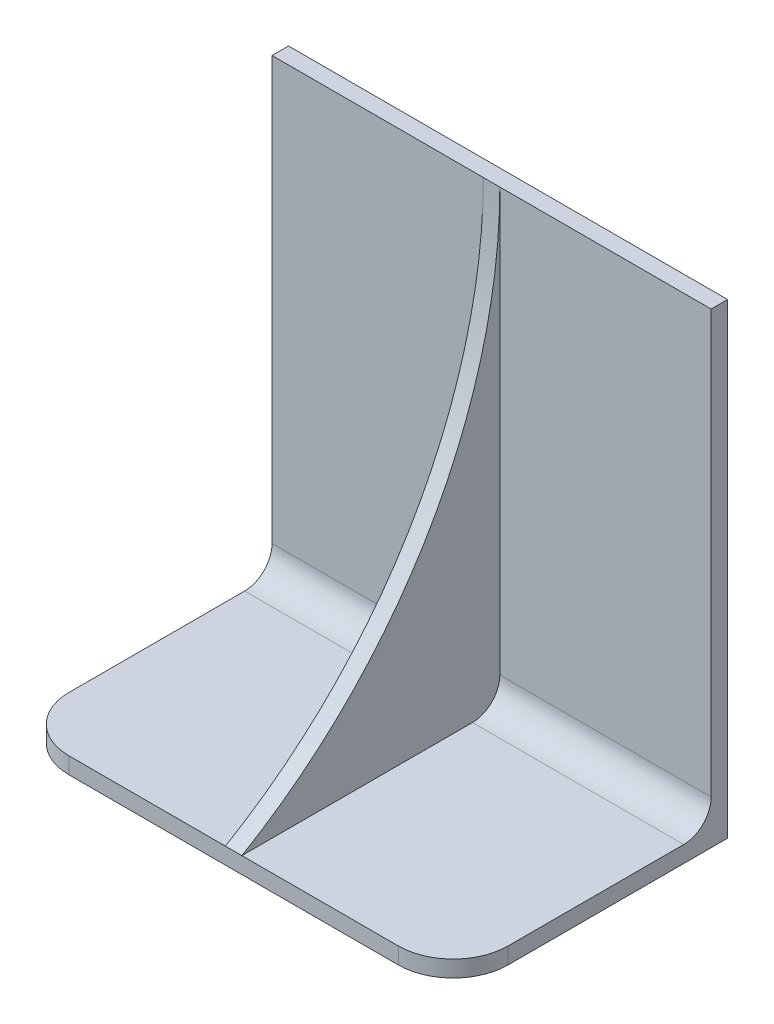
ISO-10303-21;
HEADER;
FILE_DESCRIPTION(('STEP AP214'),'2;1');
FILE_NAME('part.step','',(''),(''),'','','');
FILE_SCHEMA(('AUTOMOTIVE_DESIGN { 1 0 10303 214 1 1 1 1 }'));
ENDSEC;
DATA;
#1=APPLICATION_CONTEXT('core data for automotive mechanical design processes');
#2=APPLICATION_PROTOCOL_DEFINITION('international standard','automotive_design',2000,#1);
#3=PRODUCT_CONTEXT('',#1,'mechanical');
#4=PRODUCT('Part','Part','',(#3));
#5=PRODUCT_RELATED_PRODUCT_CATEGORY('part','',(#4));
#6=PRODUCT_DEFINITION_FORMATION('','',#4);
#7=PRODUCT_DEFINITION_CONTEXT('part definition',#1,'design');
#8=PRODUCT_DEFINITION('design','',#6,#7);
#9=PRODUCT_DEFINITION_SHAPE('','',#8);
#10=(LENGTH_UNIT() NAMED_UNIT(*) SI_UNIT(.MILLI.,.METRE.));
#11=(NAMED_UNIT(*) PLANE_ANGLE_UNIT() SI_UNIT($,.RADIAN.));
#12=(NAMED_UNIT(*) SI_UNIT($,.STERADIAN.) SOLID_ANGLE_UNIT());
#13=UNCERTAINTY_MEASURE_WITH_UNIT(LENGTH_MEASURE(1.E-05),#10,'distance_accuracy_value','');
#14=(GEOMETRIC_REPRESENTATION_CONTEXT(3) GLOBAL_UNCERTAINTY_ASSIGNED_CONTEXT((#13)) GLOBAL_UNIT_ASSIGNED_CONTEXT((#10,
#11,#12)) REPRESENTATION_CONTEXT('',''));
#15=CARTESIAN_POINT('',(0.,0.,0.));
#16=DIRECTION('',(0.,0.,1.));
#17=DIRECTION('',(1.,0.,0.));
#18=AXIS2_PLACEMENT_3D('',#15,#16,#17);
#19=CARTESIAN_POINT('',(0.,3.,0.));
#20=DIRECTION('',(0.,-1.,0.));
#21=DIRECTION('',(0.,0.,-1.));
#22=AXIS2_PLACEMENT_3D('',#19,#20,#21);
#23=PLANE('',#22);
#24=DIRECTION('',(0.,0.,-1.));
#25=VECTOR('',#24,1.);
#26=CARTESIAN_POINT('',(40.,3.,25.));
#27=LINE('',#26,#25);
#28=CARTESIAN_POINT('',(40.,3.,15.));
#29=VERTEX_POINT('',#28);
#30=CARTESIAN_POINT('',(40.,3.,-17.));
#31=VERTEX_POINT('',#30);
#32=EDGE_CURVE('E188',#29,#31,#27,.T.);
#33=ORIENTED_EDGE('',*,*,#32,.T.);
#34=DIRECTION('',(1.,0.,0.));
#35=VECTOR('',#34,1.);
#36=CARTESIAN_POINT('',(1.5,3.,-17.));
#37=LINE('',#36,#35);
#38=CARTESIAN_POINT('',(1.5,3.,-17.));
#39=VERTEX_POINT('',#38);
#40=EDGE_CURVE('E174',#31,#39,#37,.F.);
#41=ORIENTED_EDGE('',*,*,#40,.T.);
#42=DIRECTION('',(0.,0.,-1.));
#43=VECTOR('',#42,1.);
#44=CARTESIAN_POINT('',(1.5,3.,25.));
#45=LINE('',#44,#43);
#46=CARTESIAN_POINT('',(1.5,3.,25.));
#47=VERTEX_POINT('',#46);
#48=EDGE_CURVE('E145',#47,#39,#45,.T.);
#49=ORIENTED_EDGE('',*,*,#48,.F.);
#50=DIRECTION('',(1.,0.,0.));
#51=VECTOR('',#50,1.);
#52=CARTESIAN_POINT('',(-40.,3.,25.));
#53=LINE('',#52,#51);
#54=CARTESIAN_POINT('',(30.,3.,25.));
#55=VERTEX_POINT('',#54);
#56=EDGE_CURVE('E171',#47,#55,#53,.T.);
#57=ORIENTED_EDGE('',*,*,#56,.T.);
#58=CARTESIAN_POINT('',(30.,3.,15.));
#59=DIRECTION('',(0.,-1.,0.));
#60=DIRECTION('',(0.,0.,-1.));
#61=AXIS2_PLACEMENT_3D('',#58,#59,#60);
#62=CIRCLE('',#61,10.);
#63=EDGE_CURVE('E236',#55,#29,#62,.F.);
#64=ORIENTED_EDGE('',*,*,#63,.T.);
#65=EDGE_LOOP('',(#33,#41,#49,#57,#64));
#66=FACE_BOUND('',#65,.T.);
#67=ADVANCED_FACE('F45',(#66),#23,.F.);
#68=CARTESIAN_POINT('',(-40.,85.,-22.));
#69=DIRECTION('',(0.,0.,-1.));
#70=DIRECTION('',(-1.,0.,0.));
#71=AXIS2_PLACEMENT_3D('',#68,#69,#70);
#72=PLANE('',#71);
#73=DIRECTION('',(0.,1.,0.));
#74=VECTOR('',#73,1.);
#75=CARTESIAN_POINT('',(1.5,85.,-22.));
#76=LINE('',#75,#74);
#77=CARTESIAN_POINT('',(1.5,7.99999999999999,-22.));
#78=VERTEX_POINT('',#77);
#79=CARTESIAN_POINT('',(1.5,85.,-22.));
#80=VERTEX_POINT('',#79);
#81=EDGE_CURVE('E148',#78,#80,#76,.T.);
#82=ORIENTED_EDGE('',*,*,#81,.F.);
#83=DIRECTION('',(1.,0.,0.));
#84=VECTOR('',#83,1.);
#85=CARTESIAN_POINT('',(40.,7.99999999999999,-22.));
#86=LINE('',#85,#84);
#87=CARTESIAN_POINT('',(40.,7.99999999999999,-22.));
#88=VERTEX_POINT('',#87);
#89=EDGE_CURVE('E239',#78,#88,#86,.T.);
#90=ORIENTED_EDGE('',*,*,#89,.T.);
#91=DIRECTION('',(0.,-1.,0.));
#92=VECTOR('',#91,1.);
#93=CARTESIAN_POINT('',(40.,85.,-22.));
#94=LINE('',#93,#92);
#95=CARTESIAN_POINT('',(40.,85.,-22.));
#96=VERTEX_POINT('',#95);
#97=EDGE_CURVE('E263',#96,#88,#94,.T.);
#98=ORIENTED_EDGE('',*,*,#97,.F.);
#99=DIRECTION('',(1.,0.,0.));
#100=VECTOR('',#99,1.);
#101=CARTESIAN_POINT('',(-40.,85.,-22.));
#102=LINE('',#101,#100);
#103=EDGE_CURVE('E270',#80,#96,#102,.T.);
#104=ORIENTED_EDGE('',*,*,#103,.F.);
#105=EDGE_LOOP('',(#82,#90,#98,#104));
#106=FACE_BOUND('',#105,.T.);
#107=ADVANCED_FACE('F269',(#106),#72,.F.);
#108=DIRECTION('',(0.,0.,-1.));
#109=VECTOR('',#108,1.);
#110=CARTESIAN_POINT('',(-1.5,3.,25.));
#111=LINE('',#110,#109);
#112=CARTESIAN_POINT('',(-1.5,3.,25.));
#113=VERTEX_POINT('',#112);
#114=CARTESIAN_POINT('',(-1.5,3.,-17.));
#115=VERTEX_POINT('',#114);
#116=EDGE_CURVE('E279',#113,#115,#111,.T.);
#117=ORIENTED_EDGE('',*,*,#116,.T.);
#118=DIRECTION('',(1.,0.,0.));
#119=VECTOR('',#118,1.);
#120=CARTESIAN_POINT('',(-40.,3.,-17.));
#121=LINE('',#120,#119);
#122=CARTESIAN_POINT('',(-40.,3.,-17.));
#123=VERTEX_POINT('',#122);
#124=EDGE_CURVE('E61',#115,#123,#121,.F.);
#125=ORIENTED_EDGE('',*,*,#124,.T.);
#126=DIRECTION('',(0.,0.,1.));
#127=VECTOR('',#126,1.);
#128=CARTESIAN_POINT('',(-40.,3.,25.));
#129=LINE('',#128,#127);
#130=CARTESIAN_POINT('',(-40.,3.,15.));
#131=VERTEX_POINT('',#130);
#132=EDGE_CURVE('E183',#123,#131,#129,.T.);
#133=ORIENTED_EDGE('',*,*,#132,.T.);
#134=CARTESIAN_POINT('',(-30.,3.,15.));
#135=DIRECTION('',(0.,-1.,0.));
#136=DIRECTION('',(0.,0.,-1.));
#137=AXIS2_PLACEMENT_3D('',#134,#135,#136);
#138=CIRCLE('',#137,10.);
#139=CARTESIAN_POINT('',(-30.,3.,25.));
#140=VERTEX_POINT('',#139);
#141=EDGE_CURVE('E229',#131,#140,#138,.F.);
#142=ORIENTED_EDGE('',*,*,#141,.T.);
#143=EDGE_CURVE('E182',#140,#113,#53,.T.);
#144=ORIENTED_EDGE('',*,*,#143,.T.);
#145=EDGE_LOOP('',(#117,#125,#133,#142,#144));
#146=FACE_BOUND('',#145,.T.);
#147=ADVANCED_FACE('F314',(#146),#23,.F.);
#148=CARTESIAN_POINT('',(40.,3.,25.));
#149=DIRECTION('',(-1.,0.,0.));
#150=DIRECTION('',(0.,0.,1.));
#151=AXIS2_PLACEMENT_3D('',#148,#149,#150);
#152=PLANE('',#151);
#153=ORIENTED_EDGE('',*,*,#32,.F.);
#154=DIRECTION('',(0.,-1.,0.));
#155=VECTOR('',#154,1.);
#156=CARTESIAN_POINT('',(40.,3.,15.));
#157=LINE('',#156,#155);
#158=CARTESIAN_POINT('',(40.,0.,15.));
#159=VERTEX_POINT('',#158);
#160=EDGE_CURVE('E232',#29,#159,#157,.T.);
#161=ORIENTED_EDGE('',*,*,#160,.T.);
#162=DIRECTION('',(0.,0.,-1.));
#163=VECTOR('',#162,1.);
#164=CARTESIAN_POINT('',(40.,0.,25.));
#165=LINE('',#164,#163);
#166=CARTESIAN_POINT('',(40.,0.,-25.));
#167=VERTEX_POINT('',#166);
#168=EDGE_CURVE('E192',#159,#167,#165,.T.);
#169=ORIENTED_EDGE('',*,*,#168,.T.);
#170=DIRECTION('',(0.,-1.,0.));
#171=VECTOR('',#170,1.);
#172=CARTESIAN_POINT('',(40.,3.,-25.));
#173=LINE('',#172,#171);
#174=CARTESIAN_POINT('',(40.,85.,-25.));
#175=VERTEX_POINT('',#174);
#176=EDGE_CURVE('E209',#175,#167,#173,.T.);
#177=ORIENTED_EDGE('',*,*,#176,.F.);
#178=DIRECTION('',(0.,0.,-1.));
#179=VECTOR('',#178,1.);
#180=CARTESIAN_POINT('',(40.,85.,-25.));
#181=LINE('',#180,#179);
#182=EDGE_CURVE('E291',#96,#175,#181,.T.);
#183=ORIENTED_EDGE('',*,*,#182,.F.);
#184=ORIENTED_EDGE('',*,*,#97,.T.);
#185=CARTESIAN_POINT('',(40.,7.99999999999999,-17.));
#186=DIRECTION('',(-1.,0.,0.));
#187=DIRECTION('',(0.,0.,1.));
#188=AXIS2_PLACEMENT_3D('',#185,#186,#187);
#189=CIRCLE('',#188,5.);
#190=EDGE_CURVE('E54',#88,#31,#189,.T.);
#191=ORIENTED_EDGE('',*,*,#190,.T.);
#192=EDGE_LOOP('',(#153,#161,#169,#177,#183,#184,#191));
#193=FACE_BOUND('',#192,.T.);
#194=ADVANCED_FACE('F259',(#193),#152,.F.);
#195=CARTESIAN_POINT('',(-40.,3.,-25.));
#196=DIRECTION('',(0.,0.,1.));
#197=DIRECTION('',(1.,0.,0.));
#198=AXIS2_PLACEMENT_3D('',#195,#196,#197);
#199=PLANE('',#198);
#200=DIRECTION('',(-1.,0.,0.));
#201=VECTOR('',#200,1.);
#202=CARTESIAN_POINT('',(-40.,0.,-25.));
#203=LINE('',#202,#201);
#204=CARTESIAN_POINT('',(-40.,0.,-25.));
#205=VERTEX_POINT('',#204);
#206=EDGE_CURVE('E195',#167,#205,#203,.T.);
#207=ORIENTED_EDGE('',*,*,#206,.T.);
#208=DIRECTION('',(0.,-1.,0.));
#209=VECTOR('',#208,1.);
#210=CARTESIAN_POINT('',(-40.,3.,-25.));
#211=LINE('',#210,#209);
#212=CARTESIAN_POINT('',(-40.,85.,-25.));
#213=VERTEX_POINT('',#212);
#214=EDGE_CURVE('E187',#213,#205,#211,.T.);
#215=ORIENTED_EDGE('',*,*,#214,.F.);
#216=DIRECTION('',(-1.,0.,0.));
#217=VECTOR('',#216,1.);
#218=CARTESIAN_POINT('',(-40.,85.,-25.));
#219=LINE('',#218,#217);
#220=EDGE_CURVE('E295',#175,#213,#219,.T.);
#221=ORIENTED_EDGE('',*,*,#220,.F.);
#222=ORIENTED_EDGE('',*,*,#176,.T.);
#223=EDGE_LOOP('',(#207,#215,#221,#222));
#224=FACE_BOUND('',#223,.T.);
#225=ADVANCED_FACE('F325',(#224),#199,.F.);
#226=CARTESIAN_POINT('',(-40.,3.,25.));
#227=DIRECTION('',(1.,0.,0.));
#228=DIRECTION('',(0.,0.,-1.));
#229=AXIS2_PLACEMENT_3D('',#226,#227,#228);
#230=PLANE('',#229);
#231=DIRECTION('',(0.,0.,1.));
#232=VECTOR('',#231,1.);
#233=CARTESIAN_POINT('',(-40.,0.,25.));
#234=LINE('',#233,#232);
#235=CARTESIAN_POINT('',(-40.,0.,15.));
#236=VERTEX_POINT('',#235);
#237=EDGE_CURVE('E199',#205,#236,#234,.T.);
#238=ORIENTED_EDGE('',*,*,#237,.T.);
#239=DIRECTION('',(0.,-1.,0.));
#240=VECTOR('',#239,1.);
#241=CARTESIAN_POINT('',(-40.,3.,15.));
#242=LINE('',#241,#240);
#243=EDGE_CURVE('E225',#236,#131,#242,.F.);
#244=ORIENTED_EDGE('',*,*,#243,.T.);
#245=ORIENTED_EDGE('',*,*,#132,.F.);
#246=CARTESIAN_POINT('',(-40.,7.99999999999999,-17.));
#247=DIRECTION('',(1.,0.,0.));
#248=DIRECTION('',(0.,0.,-1.));
#249=AXIS2_PLACEMENT_3D('',#246,#247,#248);
#250=CIRCLE('',#249,5.);
#251=CARTESIAN_POINT('',(-40.,7.99999999999999,-22.));
#252=VERTEX_POINT('',#251);
#253=EDGE_CURVE('E11',#123,#252,#250,.T.);
#254=ORIENTED_EDGE('',*,*,#253,.T.);
#255=DIRECTION('',(0.,-1.,0.));
#256=VECTOR('',#255,1.);
#257=CARTESIAN_POINT('',(-40.,85.,-22.));
#258=LINE('',#257,#256);
#259=CARTESIAN_POINT('',(-40.,85.,-22.));
#260=VERTEX_POINT('',#259);
#261=EDGE_CURVE('E196',#260,#252,#258,.T.);
#262=ORIENTED_EDGE('',*,*,#261,.F.);
#263=DIRECTION('',(0.,0.,1.));
#264=VECTOR('',#263,1.);
#265=CARTESIAN_POINT('',(-40.,85.,-25.));
#266=LINE('',#265,#264);
#267=EDGE_CURVE('E165',#213,#260,#266,.T.);
#268=ORIENTED_EDGE('',*,*,#267,.F.);
#269=ORIENTED_EDGE('',*,*,#214,.T.);
#270=EDGE_LOOP('',(#238,#244,#245,#254,#262,#268,#269));
#271=FACE_BOUND('',#270,.T.);
#272=ADVANCED_FACE('F311',(#271),#230,.F.);
#273=CARTESIAN_POINT('',(-40.,3.,25.));
#274=DIRECTION('',(0.,0.,-1.));
#275=DIRECTION('',(-1.,0.,0.));
#276=AXIS2_PLACEMENT_3D('',#273,#274,#275);
#277=PLANE('',#276);
#278=ORIENTED_EDGE('',*,*,#143,.F.);
#279=DIRECTION('',(0.,-1.,0.));
#280=VECTOR('',#279,1.);
#281=CARTESIAN_POINT('',(-30.,3.,25.));
#282=LINE('',#281,#280);
#283=CARTESIAN_POINT('',(-30.,0.,25.));
#284=VERTEX_POINT('',#283);
#285=EDGE_CURVE('E215',#140,#284,#282,.T.);
#286=ORIENTED_EDGE('',*,*,#285,.T.);
#287=DIRECTION('',(1.,0.,0.));
#288=VECTOR('',#287,1.);
#289=CARTESIAN_POINT('',(-40.,0.,25.));
#290=LINE('',#289,#288);
#291=CARTESIAN_POINT('',(30.,0.,25.));
#292=VERTEX_POINT('',#291);
#293=EDGE_CURVE('E203',#284,#292,#290,.T.);
#294=ORIENTED_EDGE('',*,*,#293,.T.);
#295=DIRECTION('',(0.,-1.,0.));
#296=VECTOR('',#295,1.);
#297=CARTESIAN_POINT('',(30.,3.,25.));
#298=LINE('',#297,#296);
#299=EDGE_CURVE('E180',#292,#55,#298,.F.);
#300=ORIENTED_EDGE('',*,*,#299,.T.);
#301=ORIENTED_EDGE('',*,*,#56,.F.);
#302=DIRECTION('',(-1.,0.,0.));
#303=VECTOR('',#302,1.);
#304=CARTESIAN_POINT('',(1.5,3.,25.));
#305=LINE('',#304,#303);
#306=EDGE_CURVE('E157',#47,#113,#305,.T.);
#307=ORIENTED_EDGE('',*,*,#306,.T.);
#308=EDGE_LOOP('',(#278,#286,#294,#300,#301,#307));
#309=FACE_BOUND('',#308,.T.);
#310=ADVANCED_FACE('F177',(#309),#277,.F.);
#311=CARTESIAN_POINT('',(0.,0.,0.));
#312=DIRECTION('',(0.,-1.,0.));
#313=DIRECTION('',(0.,0.,-1.));
#314=AXIS2_PLACEMENT_3D('',#311,#312,#313);
#315=PLANE('',#314);
#316=ORIENTED_EDGE('',*,*,#293,.F.);
#317=CARTESIAN_POINT('',(-30.,0.,15.));
#318=DIRECTION('',(0.,-1.,0.));
#319=DIRECTION('',(0.,0.,-1.));
#320=AXIS2_PLACEMENT_3D('',#317,#318,#319);
#321=CIRCLE('',#320,10.);
#322=EDGE_CURVE('E222',#284,#236,#321,.T.);
#323=ORIENTED_EDGE('',*,*,#322,.T.);
#324=ORIENTED_EDGE('',*,*,#237,.F.);
#325=ORIENTED_EDGE('',*,*,#206,.F.);
#326=ORIENTED_EDGE('',*,*,#168,.F.);
#327=CARTESIAN_POINT('',(30.,0.,15.));
#328=DIRECTION('',(0.,-1.,0.));
#329=DIRECTION('',(0.,0.,-1.));
#330=AXIS2_PLACEMENT_3D('',#327,#328,#329);
#331=CIRCLE('',#330,10.);
#332=EDGE_CURVE('E219',#159,#292,#331,.T.);
#333=ORIENTED_EDGE('',*,*,#332,.T.);
#334=EDGE_LOOP('',(#316,#323,#324,#325,#326,#333));
#335=FACE_BOUND('',#334,.T.);
#336=ADVANCED_FACE('F321',(#335),#315,.T.);
#337=ORIENTED_EDGE('',*,*,#261,.T.);
#338=DIRECTION('',(1.,0.,0.));
#339=VECTOR('',#338,1.);
#340=CARTESIAN_POINT('',(-1.5,7.99999999999999,-22.));
#341=LINE('',#340,#339);
#342=CARTESIAN_POINT('',(-1.5,7.99999999999999,-22.));
#343=VERTEX_POINT('',#342);
#344=EDGE_CURVE('E248',#252,#343,#341,.T.);
#345=ORIENTED_EDGE('',*,*,#344,.T.);
#346=DIRECTION('',(0.,1.,0.));
#347=VECTOR('',#346,1.);
#348=CARTESIAN_POINT('',(-1.5,85.,-22.));
#349=LINE('',#348,#347);
#350=CARTESIAN_POINT('',(-1.5,85.,-22.));
#351=VERTEX_POINT('',#350);
#352=EDGE_CURVE('E153',#343,#351,#349,.T.);
#353=ORIENTED_EDGE('',*,*,#352,.T.);
#354=EDGE_CURVE('E287',#260,#351,#102,.T.);
#355=ORIENTED_EDGE('',*,*,#354,.F.);
#356=EDGE_LOOP('',(#337,#345,#353,#355));
#357=FACE_BOUND('',#356,.T.);
#358=ADVANCED_FACE('F306',(#357),#72,.F.);
#359=CARTESIAN_POINT('',(0.,85.,0.));
#360=DIRECTION('',(0.,1.,0.));
#361=DIRECTION('',(0.,0.,1.));
#362=AXIS2_PLACEMENT_3D('',#359,#360,#361);
#363=PLANE('',#362);
#364=ORIENTED_EDGE('',*,*,#267,.T.);
#365=ORIENTED_EDGE('',*,*,#354,.T.);
#366=DIRECTION('',(-1.,0.,0.));
#367=VECTOR('',#366,1.);
#368=CARTESIAN_POINT('',(1.5,85.,-22.));
#369=LINE('',#368,#367);
#370=EDGE_CURVE('E166',#80,#351,#369,.T.);
#371=ORIENTED_EDGE('',*,*,#370,.F.);
#372=ORIENTED_EDGE('',*,*,#103,.T.);
#373=ORIENTED_EDGE('',*,*,#182,.T.);
#374=ORIENTED_EDGE('',*,*,#220,.T.);
#375=EDGE_LOOP('',(#364,#365,#371,#372,#373,#374));
#376=FACE_BOUND('',#375,.T.);
#377=ADVANCED_FACE('F327',(#376),#363,.T.);
#378=CARTESIAN_POINT('',(1.5,85.,73.031914893617));
#379=DIRECTION('',(-1.,0.,0.));
#380=DIRECTION('',(0.,0.,1.));
#381=AXIS2_PLACEMENT_3D('',#378,#379,#380);
#382=CYLINDRICAL_SURFACE('',#381,95.031914893617);
#383=CARTESIAN_POINT('',(-1.5,85.,73.031914893617));
#384=DIRECTION('',(-1.,0.,0.));
#385=DIRECTION('',(0.,0.,1.));
#386=AXIS2_PLACEMENT_3D('',#383,#384,#385);
#387=CIRCLE('',#386,95.031914893617);
#388=EDGE_CURVE('E160',#351,#113,#387,.T.);
#389=ORIENTED_EDGE('',*,*,#388,.T.);
#390=ORIENTED_EDGE('',*,*,#306,.F.);
#391=CARTESIAN_POINT('',(1.5,85.,73.031914893617));
#392=DIRECTION('',(-1.,0.,0.));
#393=DIRECTION('',(0.,0.,1.));
#394=AXIS2_PLACEMENT_3D('',#391,#392,#393);
#395=CIRCLE('',#394,95.031914893617);
#396=EDGE_CURVE('E141',#80,#47,#395,.T.);
#397=ORIENTED_EDGE('',*,*,#396,.F.);
#398=ORIENTED_EDGE('',*,*,#370,.T.);
#399=EDGE_LOOP('',(#389,#390,#397,#398));
#400=FACE_BOUND('',#399,.T.);
#401=ADVANCED_FACE('F158',(#400),#382,.F.);
#402=CARTESIAN_POINT('',(1.5,85.,73.031914893617));
#403=DIRECTION('',(-1.,0.,0.));
#404=DIRECTION('',(0.,0.,1.));
#405=AXIS2_PLACEMENT_3D('',#402,#403,#404);
#406=PLANE('',#405);
#407=ORIENTED_EDGE('',*,*,#48,.T.);
#408=CARTESIAN_POINT('',(1.5,7.99999999999999,-17.));
#409=DIRECTION('',(-1.,0.,0.));
#410=DIRECTION('',(0.,0.,1.));
#411=AXIS2_PLACEMENT_3D('',#408,#409,#410);
#412=CIRCLE('',#411,5.);
#413=EDGE_CURVE('E245',#39,#78,#412,.F.);
#414=ORIENTED_EDGE('',*,*,#413,.T.);
#415=ORIENTED_EDGE('',*,*,#81,.T.);
#416=ORIENTED_EDGE('',*,*,#396,.T.);
#417=EDGE_LOOP('',(#407,#414,#415,#416));
#418=FACE_BOUND('',#417,.T.);
#419=ADVANCED_FACE('F143',(#418),#406,.F.);
#420=CARTESIAN_POINT('',(-1.5,85.,73.031914893617));
#421=DIRECTION('',(-1.,0.,0.));
#422=DIRECTION('',(0.,0.,1.));
#423=AXIS2_PLACEMENT_3D('',#420,#421,#422);
#424=PLANE('',#423);
#425=ORIENTED_EDGE('',*,*,#352,.F.);
#426=CARTESIAN_POINT('',(-1.5,7.99999999999999,-17.));
#427=DIRECTION('',(-1.,0.,0.));
#428=DIRECTION('',(0.,0.,1.));
#429=AXIS2_PLACEMENT_3D('',#426,#427,#428);
#430=CIRCLE('',#429,5.);
#431=EDGE_CURVE('E69',#343,#115,#430,.T.);
#432=ORIENTED_EDGE('',*,*,#431,.T.);
#433=ORIENTED_EDGE('',*,*,#116,.F.);
#434=ORIENTED_EDGE('',*,*,#388,.F.);
#435=EDGE_LOOP('',(#425,#432,#433,#434));
#436=FACE_BOUND('',#435,.T.);
#437=ADVANCED_FACE('F338',(#436),#424,.T.);
#438=CARTESIAN_POINT('',(-30.,3.,15.));
#439=DIRECTION('',(0.,-1.,0.));
#440=DIRECTION('',(0.,0.,-1.));
#441=AXIS2_PLACEMENT_3D('',#438,#439,#440);
#442=CYLINDRICAL_SURFACE('',#441,10.);
#443=ORIENTED_EDGE('',*,*,#141,.F.);
#444=ORIENTED_EDGE('',*,*,#243,.F.);
#445=ORIENTED_EDGE('',*,*,#322,.F.);
#446=ORIENTED_EDGE('',*,*,#285,.F.);
#447=EDGE_LOOP('',(#443,#444,#445,#446));
#448=FACE_BOUND('',#447,.T.);
#449=ADVANCED_FACE('F318',(#448),#442,.T.);
#450=CARTESIAN_POINT('',(30.,3.,15.));
#451=DIRECTION('',(0.,-1.,0.));
#452=DIRECTION('',(0.,0.,-1.));
#453=AXIS2_PLACEMENT_3D('',#450,#451,#452);
#454=CYLINDRICAL_SURFACE('',#453,10.);
#455=ORIENTED_EDGE('',*,*,#63,.F.);
#456=ORIENTED_EDGE('',*,*,#299,.F.);
#457=ORIENTED_EDGE('',*,*,#332,.F.);
#458=ORIENTED_EDGE('',*,*,#160,.F.);
#459=EDGE_LOOP('',(#455,#456,#457,#458));
#460=FACE_BOUND('',#459,.T.);
#461=ADVANCED_FACE('F330',(#460),#454,.T.);
#462=CARTESIAN_POINT('',(-40.,7.99999999999999,-17.));
#463=DIRECTION('',(-1.,0.,0.));
#464=DIRECTION('',(0.,0.,1.));
#465=AXIS2_PLACEMENT_3D('',#462,#463,#464);
#466=CYLINDRICAL_SURFACE('',#465,5.);
#467=ORIENTED_EDGE('',*,*,#413,.F.);
#468=ORIENTED_EDGE('',*,*,#40,.F.);
#469=ORIENTED_EDGE('',*,*,#190,.F.);
#470=ORIENTED_EDGE('',*,*,#89,.F.);
#471=EDGE_LOOP('',(#467,#468,#469,#470));
#472=FACE_BOUND('',#471,.T.);
#473=ADVANCED_FACE('F267',(#472),#466,.F.);
#474=CARTESIAN_POINT('',(-40.,7.99999999999999,-17.));
#475=DIRECTION('',(-1.,0.,0.));
#476=DIRECTION('',(0.,0.,1.));
#477=AXIS2_PLACEMENT_3D('',#474,#475,#476);
#478=CYLINDRICAL_SURFACE('',#477,5.);
#479=ORIENTED_EDGE('',*,*,#253,.F.);
#480=ORIENTED_EDGE('',*,*,#124,.F.);
#481=ORIENTED_EDGE('',*,*,#431,.F.);
#482=ORIENTED_EDGE('',*,*,#344,.F.);
#483=EDGE_LOOP('',(#479,#480,#481,#482));
#484=FACE_BOUND('',#483,.T.);
#485=ADVANCED_FACE('F47',(#484),#478,.F.);
#486=CLOSED_SHELL('',(#67,#107,#147,#194,#225,#272,#310,#336,#358,#377,#401,#419,#437,#449,#461,
#473,#485));
#487=MANIFOLD_SOLID_BREP('B2',#486);
#488=ADVANCED_BREP_SHAPE_REPRESENTATION('',(#18,#487),#14);
#489=SHAPE_DEFINITION_REPRESENTATION(#9,#488);
ENDSEC;
END-ISO-10303-21;
